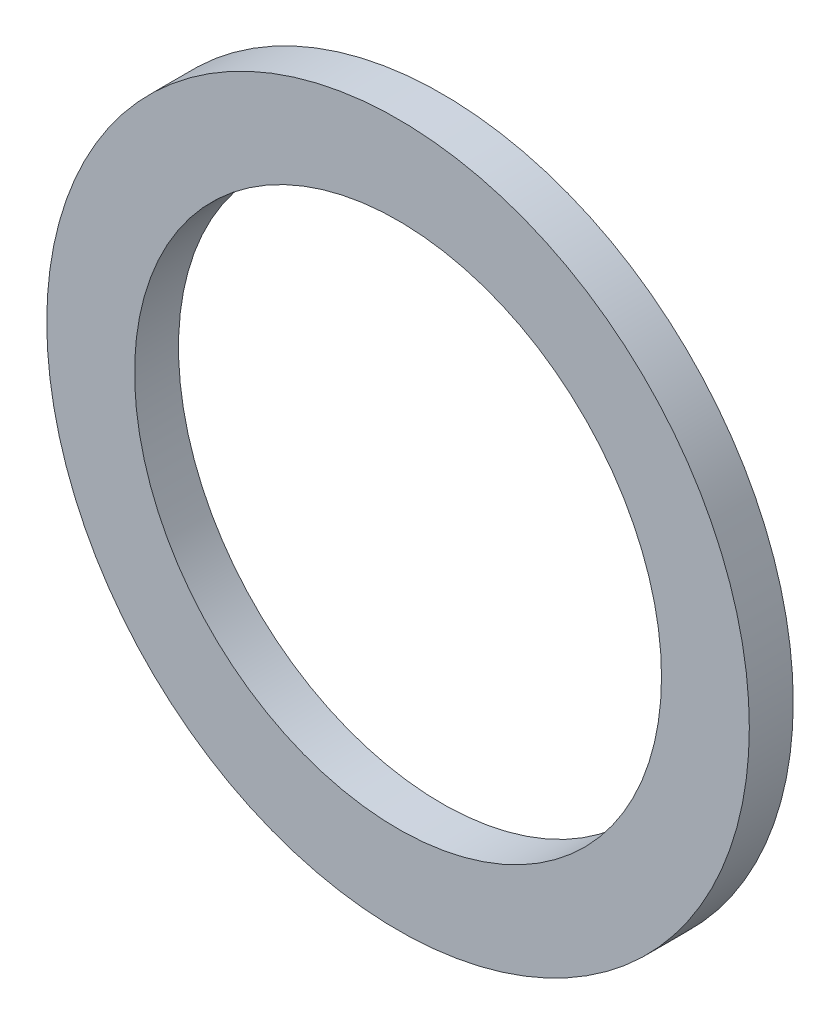
ISO-10303-21;
HEADER;
FILE_DESCRIPTION(('STEP AP214'),'2;1');
FILE_NAME('part.step','',(''),(''),'','','');
FILE_SCHEMA(('AUTOMOTIVE_DESIGN { 1 0 10303 214 1 1 1 1 }'));
ENDSEC;
DATA;
#1=APPLICATION_CONTEXT('core data for automotive mechanical design processes');
#2=APPLICATION_PROTOCOL_DEFINITION('international standard','automotive_design',2000,#1);
#3=PRODUCT_CONTEXT('',#1,'mechanical');
#4=PRODUCT('Part','Part','',(#3));
#5=PRODUCT_RELATED_PRODUCT_CATEGORY('part','',(#4));
#6=PRODUCT_DEFINITION_FORMATION('','',#4);
#7=PRODUCT_DEFINITION_CONTEXT('part definition',#1,'design');
#8=PRODUCT_DEFINITION('design','',#6,#7);
#9=PRODUCT_DEFINITION_SHAPE('','',#8);
#10=(LENGTH_UNIT() NAMED_UNIT(*) SI_UNIT(.MILLI.,.METRE.));
#11=(NAMED_UNIT(*) PLANE_ANGLE_UNIT() SI_UNIT($,.RADIAN.));
#12=(NAMED_UNIT(*) SI_UNIT($,.STERADIAN.) SOLID_ANGLE_UNIT());
#13=UNCERTAINTY_MEASURE_WITH_UNIT(LENGTH_MEASURE(1.E-05),#10,'distance_accuracy_value','');
#14=(GEOMETRIC_REPRESENTATION_CONTEXT(3) GLOBAL_UNCERTAINTY_ASSIGNED_CONTEXT((#13)) GLOBAL_UNIT_ASSIGNED_CONTEXT((#10,
#11,#12)) REPRESENTATION_CONTEXT('',''));
#15=CARTESIAN_POINT('',(0.,0.,0.));
#16=DIRECTION('',(0.,0.,1.));
#17=DIRECTION('',(1.,0.,0.));
#18=AXIS2_PLACEMENT_3D('',#15,#16,#17);
#19=CARTESIAN_POINT('',(0.,0.,2.5));
#20=DIRECTION('',(0.,0.,1.));
#21=DIRECTION('',(1.,0.,0.));
#22=AXIS2_PLACEMENT_3D('',#19,#20,#21);
#23=PLANE('',#22);
#24=CARTESIAN_POINT('',(0.,0.,2.5));
#25=DIRECTION('',(0.,0.,1.));
#26=DIRECTION('',(1.,0.,0.));
#27=AXIS2_PLACEMENT_3D('',#24,#25,#26);
#28=CIRCLE('',#27,20.);
#29=CARTESIAN_POINT('',(20.,0.,2.5));
#30=VERTEX_POINT('',#29);
#31=EDGE_CURVE('E10',#30,#30,#28,.T.);
#32=ORIENTED_EDGE('',*,*,#31,.T.);
#33=EDGE_LOOP('',(#32));
#34=FACE_BOUND('',#33,.T.);
#35=CARTESIAN_POINT('',(0.,0.,2.5));
#36=DIRECTION('',(0.,0.,1.));
#37=DIRECTION('',(1.,0.,0.));
#38=AXIS2_PLACEMENT_3D('',#35,#36,#37);
#39=CIRCLE('',#38,15.);
#40=CARTESIAN_POINT('',(15.,0.,2.5));
#41=VERTEX_POINT('',#40);
#42=EDGE_CURVE('E50',#41,#41,#39,.T.);
#43=ORIENTED_EDGE('',*,*,#42,.F.);
#44=EDGE_LOOP('',(#43));
#45=FACE_BOUND('',#44,.T.);
#46=ADVANCED_FACE('F37',(#34,#45),#23,.T.);
#47=CARTESIAN_POINT('',(0.,0.,0.));
#48=DIRECTION('',(0.,0.,1.));
#49=DIRECTION('',(1.,0.,0.));
#50=AXIS2_PLACEMENT_3D('',#47,#48,#49);
#51=PLANE('',#50);
#52=CARTESIAN_POINT('',(0.,0.,0.));
#53=DIRECTION('',(0.,0.,1.));
#54=DIRECTION('',(1.,0.,0.));
#55=AXIS2_PLACEMENT_3D('',#52,#53,#54);
#56=CIRCLE('',#55,20.);
#57=CARTESIAN_POINT('',(20.,0.,0.));
#58=VERTEX_POINT('',#57);
#59=EDGE_CURVE('E41',#58,#58,#56,.T.);
#60=ORIENTED_EDGE('',*,*,#59,.F.);
#61=EDGE_LOOP('',(#60));
#62=FACE_BOUND('',#61,.T.);
#63=CARTESIAN_POINT('',(0.,0.,0.));
#64=DIRECTION('',(0.,0.,1.));
#65=DIRECTION('',(1.,0.,0.));
#66=AXIS2_PLACEMENT_3D('',#63,#64,#65);
#67=CIRCLE('',#66,15.);
#68=CARTESIAN_POINT('',(15.,0.,0.));
#69=VERTEX_POINT('',#68);
#70=EDGE_CURVE('E52',#69,#69,#67,.T.);
#71=ORIENTED_EDGE('',*,*,#70,.T.);
#72=EDGE_LOOP('',(#71));
#73=FACE_BOUND('',#72,.T.);
#74=ADVANCED_FACE('F64',(#62,#73),#51,.F.);
#75=CARTESIAN_POINT('',(0.,0.,2.5));
#76=DIRECTION('',(0.,0.,-1.));
#77=DIRECTION('',(-1.,0.,0.));
#78=AXIS2_PLACEMENT_3D('',#75,#76,#77);
#79=CYLINDRICAL_SURFACE('',#78,20.);
#80=ORIENTED_EDGE('',*,*,#31,.F.);
#81=EDGE_LOOP('',(#80));
#82=FACE_BOUND('',#81,.T.);
#83=ORIENTED_EDGE('',*,*,#59,.T.);
#84=EDGE_LOOP('',(#83));
#85=FACE_BOUND('',#84,.T.);
#86=ADVANCED_FACE('F39',(#82,#85),#79,.T.);
#87=CARTESIAN_POINT('',(0.,0.,2.5));
#88=DIRECTION('',(0.,0.,-1.));
#89=DIRECTION('',(-1.,0.,0.));
#90=AXIS2_PLACEMENT_3D('',#87,#88,#89);
#91=CYLINDRICAL_SURFACE('',#90,15.);
#92=ORIENTED_EDGE('',*,*,#42,.T.);
#93=EDGE_LOOP('',(#92));
#94=FACE_BOUND('',#93,.T.);
#95=ORIENTED_EDGE('',*,*,#70,.F.);
#96=EDGE_LOOP('',(#95));
#97=FACE_BOUND('',#96,.T.);
#98=ADVANCED_FACE('F60',(#94,#97),#91,.F.);
#99=CLOSED_SHELL('',(#46,#74,#86,#98));
#100=MANIFOLD_SOLID_BREP('B2',#99);
#101=ADVANCED_BREP_SHAPE_REPRESENTATION('',(#18,#100),#14);
#102=SHAPE_DEFINITION_REPRESENTATION(#9,#101);
ENDSEC;
END-ISO-10303-21;
